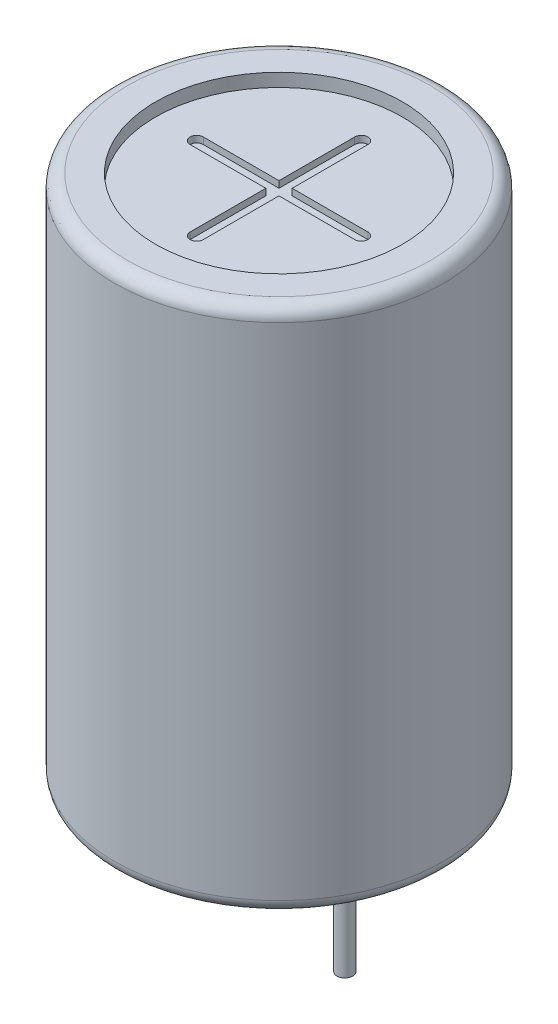
ISO-10303-21;
HEADER;
FILE_DESCRIPTION(('STEP AP214'),'2;1');
FILE_NAME('part.step','',(''),(''),'','','');
FILE_SCHEMA(('AUTOMOTIVE_DESIGN { 1 0 10303 214 1 1 1 1 }'));
ENDSEC;
DATA;
#1=APPLICATION_CONTEXT('core data for automotive mechanical design processes');
#2=APPLICATION_PROTOCOL_DEFINITION('international standard','automotive_design',2000,#1);
#3=PRODUCT_CONTEXT('',#1,'mechanical');
#4=PRODUCT('Part','Part','',(#3));
#5=PRODUCT_RELATED_PRODUCT_CATEGORY('part','',(#4));
#6=PRODUCT_DEFINITION_FORMATION('','',#4);
#7=PRODUCT_DEFINITION_CONTEXT('part definition',#1,'design');
#8=PRODUCT_DEFINITION('design','',#6,#7);
#9=PRODUCT_DEFINITION_SHAPE('','',#8);
#10=(LENGTH_UNIT() NAMED_UNIT(*) SI_UNIT(.MILLI.,.METRE.));
#11=(NAMED_UNIT(*) PLANE_ANGLE_UNIT() SI_UNIT($,.RADIAN.));
#12=(NAMED_UNIT(*) SI_UNIT($,.STERADIAN.) SOLID_ANGLE_UNIT());
#13=UNCERTAINTY_MEASURE_WITH_UNIT(LENGTH_MEASURE(1.E-05),#10,'distance_accuracy_value','');
#14=(GEOMETRIC_REPRESENTATION_CONTEXT(3) GLOBAL_UNCERTAINTY_ASSIGNED_CONTEXT((#13)) GLOBAL_UNIT_ASSIGNED_CONTEXT((#10,
#11,#12)) REPRESENTATION_CONTEXT('',''));
#15=CARTESIAN_POINT('',(0.,0.,0.));
#16=DIRECTION('',(0.,0.,1.));
#17=DIRECTION('',(1.,0.,0.));
#18=AXIS2_PLACEMENT_3D('',#15,#16,#17);
#19=CARTESIAN_POINT('',(-3.125,19.25,-0.250000000000001));
#20=DIRECTION('',(0.,0.,-1.));
#21=DIRECTION('',(-1.,0.,0.));
#22=AXIS2_PLACEMENT_3D('',#19,#20,#21);
#23=PLANE('',#22);
#24=DIRECTION('',(-1.,0.,0.));
#25=VECTOR('',#24,1.);
#26=CARTESIAN_POINT('',(-3.125,19.25,-0.250000000000001));
#27=LINE('',#26,#25);
#28=CARTESIAN_POINT('',(-0.250000000000001,19.25,-0.250000000000002));
#29=VERTEX_POINT('',#28);
#30=CARTESIAN_POINT('',(-3.125,19.25,-0.250000000000001));
#31=VERTEX_POINT('',#30);
#32=EDGE_CURVE('E218',#29,#31,#27,.T.);
#33=ORIENTED_EDGE('',*,*,#32,.F.);
#34=DIRECTION('',(0.,1.,0.));
#35=VECTOR('',#34,1.);
#36=CARTESIAN_POINT('',(-0.250000000000001,19.25,-0.250000000000002));
#37=LINE('',#36,#35);
#38=CARTESIAN_POINT('',(-0.250000000000002,19.5,-0.250000000000001));
#39=VERTEX_POINT('',#38);
#40=EDGE_CURVE('E201',#29,#39,#37,.T.);
#41=ORIENTED_EDGE('',*,*,#40,.T.);
#42=DIRECTION('',(-1.,0.,0.));
#43=VECTOR('',#42,1.);
#44=CARTESIAN_POINT('',(-3.125,19.5,-0.250000000000001));
#45=LINE('',#44,#43);
#46=CARTESIAN_POINT('',(-3.125,19.5,-0.250000000000001));
#47=VERTEX_POINT('',#46);
#48=EDGE_CURVE('E234',#39,#47,#45,.T.);
#49=ORIENTED_EDGE('',*,*,#48,.T.);
#50=DIRECTION('',(0.,1.,0.));
#51=VECTOR('',#50,1.);
#52=CARTESIAN_POINT('',(-3.125,19.25,-0.250000000000001));
#53=LINE('',#52,#51);
#54=EDGE_CURVE('E238',#31,#47,#53,.T.);
#55=ORIENTED_EDGE('',*,*,#54,.F.);
#56=EDGE_LOOP('',(#33,#41,#49,#55));
#57=FACE_BOUND('',#56,.T.);
#58=ADVANCED_FACE('F43',(#57),#23,.F.);
#59=CARTESIAN_POINT('',(-3.125,19.25,0.250000000000001));
#60=DIRECTION('',(0.,0.,1.));
#61=DIRECTION('',(1.,0.,0.));
#62=AXIS2_PLACEMENT_3D('',#59,#60,#61);
#63=PLANE('',#62);
#64=DIRECTION('',(1.,0.,0.));
#65=VECTOR('',#64,1.);
#66=CARTESIAN_POINT('',(-3.125,19.5,0.250000000000001));
#67=LINE('',#66,#65);
#68=CARTESIAN_POINT('',(-3.125,19.5,0.250000000000001));
#69=VERTEX_POINT('',#68);
#70=CARTESIAN_POINT('',(-0.250000000000002,19.5,0.250000000000001));
#71=VERTEX_POINT('',#70);
#72=EDGE_CURVE('E226',#69,#71,#67,.T.);
#73=ORIENTED_EDGE('',*,*,#72,.T.);
#74=DIRECTION('',(0.,-1.,0.));
#75=VECTOR('',#74,1.);
#76=CARTESIAN_POINT('',(-0.250000000000001,19.25,0.250000000000001));
#77=LINE('',#76,#75);
#78=CARTESIAN_POINT('',(-0.250000000000002,19.25,0.250000000000001));
#79=VERTEX_POINT('',#78);
#80=EDGE_CURVE('E197',#71,#79,#77,.T.);
#81=ORIENTED_EDGE('',*,*,#80,.T.);
#82=DIRECTION('',(1.,0.,0.));
#83=VECTOR('',#82,1.);
#84=CARTESIAN_POINT('',(-3.125,19.25,0.250000000000001));
#85=LINE('',#84,#83);
#86=CARTESIAN_POINT('',(-3.125,19.25,0.250000000000001));
#87=VERTEX_POINT('',#86);
#88=EDGE_CURVE('E212',#87,#79,#85,.T.);
#89=ORIENTED_EDGE('',*,*,#88,.F.);
#90=DIRECTION('',(0.,1.,0.));
#91=VECTOR('',#90,1.);
#92=CARTESIAN_POINT('',(-3.125,19.25,0.250000000000001));
#93=LINE('',#92,#91);
#94=EDGE_CURVE('E222',#87,#69,#93,.T.);
#95=ORIENTED_EDGE('',*,*,#94,.T.);
#96=EDGE_LOOP('',(#73,#81,#89,#95));
#97=FACE_BOUND('',#96,.T.);
#98=ADVANCED_FACE('F306',(#97),#63,.F.);
#99=CARTESIAN_POINT('',(0.,20.,0.));
#100=DIRECTION('',(0.,-1.,0.));
#101=DIRECTION('',(0.,0.,-1.));
#102=AXIS2_PLACEMENT_3D('',#99,#100,#101);
#103=CYLINDRICAL_SURFACE('',#102,6.25);
#104=CARTESIAN_POINT('',(0.,0.5,0.));
#105=DIRECTION('',(0.,1.,0.));
#106=DIRECTION('',(0.,0.,1.));
#107=AXIS2_PLACEMENT_3D('',#104,#105,#106);
#108=CIRCLE('',#107,6.25);
#109=CARTESIAN_POINT('',(0.,0.5,6.25));
#110=VERTEX_POINT('',#109);
#111=EDGE_CURVE('E272',#110,#110,#108,.T.);
#112=ORIENTED_EDGE('',*,*,#111,.T.);
#113=EDGE_LOOP('',(#112));
#114=FACE_BOUND('',#113,.T.);
#115=CARTESIAN_POINT('',(0.,19.5,0.));
#116=DIRECTION('',(0.,1.,0.));
#117=DIRECTION('',(0.,0.,1.));
#118=AXIS2_PLACEMENT_3D('',#115,#116,#117);
#119=CIRCLE('',#118,6.25);
#120=CARTESIAN_POINT('',(0.,19.5,6.25));
#121=VERTEX_POINT('',#120);
#122=EDGE_CURVE('E268',#121,#121,#119,.F.);
#123=ORIENTED_EDGE('',*,*,#122,.T.);
#124=EDGE_LOOP('',(#123));
#125=FACE_BOUND('',#124,.T.);
#126=ADVANCED_FACE('F303',(#114,#125),#103,.T.);
#127=CARTESIAN_POINT('',(0.,20.,0.));
#128=DIRECTION('',(0.,1.,0.));
#129=DIRECTION('',(0.,0.,1.));
#130=AXIS2_PLACEMENT_3D('',#127,#128,#129);
#131=PLANE('',#130);
#132=CARTESIAN_POINT('',(0.,20.,0.));
#133=DIRECTION('',(0.,1.,0.));
#134=DIRECTION('',(0.,0.,1.));
#135=AXIS2_PLACEMENT_3D('',#132,#133,#134);
#136=CIRCLE('',#135,4.6875);
#137=CARTESIAN_POINT('',(0.,20.,4.6875));
#138=VERTEX_POINT('',#137);
#139=EDGE_CURVE('E256',#138,#138,#136,.T.);
#140=ORIENTED_EDGE('',*,*,#139,.F.);
#141=EDGE_LOOP('',(#140));
#142=FACE_BOUND('',#141,.T.);
#143=CARTESIAN_POINT('',(0.,20.,0.));
#144=DIRECTION('',(0.,1.,0.));
#145=DIRECTION('',(0.,0.,1.));
#146=AXIS2_PLACEMENT_3D('',#143,#144,#145);
#147=CIRCLE('',#146,5.75);
#148=CARTESIAN_POINT('',(0.,20.,5.75));
#149=VERTEX_POINT('',#148);
#150=EDGE_CURVE('E280',#149,#149,#147,.T.);
#151=ORIENTED_EDGE('',*,*,#150,.T.);
#152=EDGE_LOOP('',(#151));
#153=FACE_BOUND('',#152,.T.);
#154=ADVANCED_FACE('F294',(#142,#153),#131,.T.);
#155=CARTESIAN_POINT('',(0.,0.,0.));
#156=DIRECTION('',(0.,1.,0.));
#157=DIRECTION('',(0.,0.,1.));
#158=AXIS2_PLACEMENT_3D('',#155,#156,#157);
#159=PLANE('',#158);
#160=CARTESIAN_POINT('',(2.5,0.,0.));
#161=DIRECTION('',(0.,1.,0.));
#162=DIRECTION('',(0.,0.,1.));
#163=AXIS2_PLACEMENT_3D('',#160,#161,#162);
#164=CIRCLE('',#163,0.3);
#165=CARTESIAN_POINT('',(2.5,0.,0.300000000000001));
#166=VERTEX_POINT('',#165);
#167=EDGE_CURVE('E11',#166,#166,#164,.F.);
#168=ORIENTED_EDGE('',*,*,#167,.F.);
#169=EDGE_LOOP('',(#168));
#170=FACE_BOUND('',#169,.T.);
#171=CARTESIAN_POINT('',(-2.5,0.,0.));
#172=DIRECTION('',(0.,1.,0.));
#173=DIRECTION('',(0.,0.,1.));
#174=AXIS2_PLACEMENT_3D('',#171,#172,#173);
#175=CIRCLE('',#174,0.3);
#176=CARTESIAN_POINT('',(-2.5,0.,0.3));
#177=VERTEX_POINT('',#176);
#178=EDGE_CURVE('E52',#177,#177,#175,.F.);
#179=ORIENTED_EDGE('',*,*,#178,.F.);
#180=EDGE_LOOP('',(#179));
#181=FACE_BOUND('',#180,.T.);
#182=CARTESIAN_POINT('',(0.,0.,0.));
#183=DIRECTION('',(0.,1.,0.));
#184=DIRECTION('',(0.,0.,1.));
#185=AXIS2_PLACEMENT_3D('',#182,#183,#184);
#186=CIRCLE('',#185,5.75);
#187=CARTESIAN_POINT('',(0.,0.,5.75));
#188=VERTEX_POINT('',#187);
#189=EDGE_CURVE('E276',#188,#188,#186,.F.);
#190=ORIENTED_EDGE('',*,*,#189,.T.);
#191=EDGE_LOOP('',(#190));
#192=FACE_BOUND('',#191,.T.);
#193=ADVANCED_FACE('F290',(#170,#181,#192),#159,.F.);
#194=CARTESIAN_POINT('',(0.,0.5,0.));
#195=DIRECTION('',(0.,1.,0.));
#196=DIRECTION('',(0.,0.,1.));
#197=AXIS2_PLACEMENT_3D('',#194,#195,#196);
#198=TOROIDAL_SURFACE('',#197,5.75,0.5);
#199=ORIENTED_EDGE('',*,*,#189,.F.);
#200=EDGE_LOOP('',(#199));
#201=FACE_BOUND('',#200,.T.);
#202=ORIENTED_EDGE('',*,*,#111,.F.);
#203=EDGE_LOOP('',(#202));
#204=FACE_BOUND('',#203,.T.);
#205=ADVANCED_FACE('F293',(#201,#204),#198,.T.);
#206=CARTESIAN_POINT('',(0.,19.5,0.));
#207=DIRECTION('',(0.,1.,0.));
#208=DIRECTION('',(0.,0.,1.));
#209=AXIS2_PLACEMENT_3D('',#206,#207,#208);
#210=TOROIDAL_SURFACE('',#209,5.75,0.5);
#211=ORIENTED_EDGE('',*,*,#122,.F.);
#212=EDGE_LOOP('',(#211));
#213=FACE_BOUND('',#212,.T.);
#214=ORIENTED_EDGE('',*,*,#150,.F.);
#215=EDGE_LOOP('',(#214));
#216=FACE_BOUND('',#215,.T.);
#217=ADVANCED_FACE('F45',(#213,#216),#210,.T.);
#218=CARTESIAN_POINT('',(-2.5,-5.,0.));
#219=DIRECTION('',(0.,1.,0.));
#220=DIRECTION('',(0.,0.,1.));
#221=AXIS2_PLACEMENT_3D('',#218,#219,#220);
#222=CYLINDRICAL_SURFACE('',#221,0.3);
#223=CARTESIAN_POINT('',(-2.5,-5.,0.));
#224=DIRECTION('',(0.,-1.,0.));
#225=DIRECTION('',(0.,0.,-1.));
#226=AXIS2_PLACEMENT_3D('',#223,#224,#225);
#227=CIRCLE('',#226,0.3);
#228=CARTESIAN_POINT('',(-2.5,-5.,-0.3));
#229=VERTEX_POINT('',#228);
#230=EDGE_CURVE('E264',#229,#229,#227,.T.);
#231=ORIENTED_EDGE('',*,*,#230,.F.);
#232=EDGE_LOOP('',(#231));
#233=FACE_BOUND('',#232,.T.);
#234=ORIENTED_EDGE('',*,*,#178,.T.);
#235=EDGE_LOOP('',(#234));
#236=FACE_BOUND('',#235,.T.);
#237=ADVANCED_FACE('F288',(#233,#236),#222,.T.);
#238=CARTESIAN_POINT('',(-2.5,-5.,0.));
#239=DIRECTION('',(0.,-1.,0.));
#240=DIRECTION('',(0.,0.,-1.));
#241=AXIS2_PLACEMENT_3D('',#238,#239,#240);
#242=PLANE('',#241);
#243=ORIENTED_EDGE('',*,*,#230,.T.);
#244=EDGE_LOOP('',(#243));
#245=FACE_BOUND('',#244,.T.);
#246=ADVANCED_FACE('F522',(#245),#242,.T.);
#247=CARTESIAN_POINT('',(2.5,-5.,0.));
#248=DIRECTION('',(0.,1.,0.));
#249=DIRECTION('',(0.,0.,1.));
#250=AXIS2_PLACEMENT_3D('',#247,#248,#249);
#251=CYLINDRICAL_SURFACE('',#250,0.3);
#252=CARTESIAN_POINT('',(2.5,-5.,0.));
#253=DIRECTION('',(0.,-1.,0.));
#254=DIRECTION('',(0.,0.,-1.));
#255=AXIS2_PLACEMENT_3D('',#252,#253,#254);
#256=CIRCLE('',#255,0.3);
#257=CARTESIAN_POINT('',(2.5,-5.,-0.299999999999999));
#258=VERTEX_POINT('',#257);
#259=EDGE_CURVE('E260',#258,#258,#256,.T.);
#260=ORIENTED_EDGE('',*,*,#259,.F.);
#261=EDGE_LOOP('',(#260));
#262=FACE_BOUND('',#261,.T.);
#263=ORIENTED_EDGE('',*,*,#167,.T.);
#264=EDGE_LOOP('',(#263));
#265=FACE_BOUND('',#264,.T.);
#266=ADVANCED_FACE('F513',(#262,#265),#251,.T.);
#267=CARTESIAN_POINT('',(2.5,-5.,0.));
#268=DIRECTION('',(0.,-1.,0.));
#269=DIRECTION('',(0.,0.,-1.));
#270=AXIS2_PLACEMENT_3D('',#267,#268,#269);
#271=PLANE('',#270);
#272=ORIENTED_EDGE('',*,*,#259,.T.);
#273=EDGE_LOOP('',(#272));
#274=FACE_BOUND('',#273,.T.);
#275=ADVANCED_FACE('F503',(#274),#271,.T.);
#276=CARTESIAN_POINT('',(0.,19.,0.));
#277=DIRECTION('',(0.,1.,0.));
#278=DIRECTION('',(0.,0.,1.));
#279=AXIS2_PLACEMENT_3D('',#276,#277,#278);
#280=CYLINDRICAL_SURFACE('',#279,4.6875);
#281=CARTESIAN_POINT('',(0.,19.5,0.));
#282=DIRECTION('',(0.,1.,0.));
#283=DIRECTION('',(0.,0.,1.));
#284=AXIS2_PLACEMENT_3D('',#281,#282,#283);
#285=CIRCLE('',#284,4.6875);
#286=CARTESIAN_POINT('',(0.,19.5,4.6875));
#287=VERTEX_POINT('',#286);
#288=EDGE_CURVE('E242',#287,#287,#285,.T.);
#289=ORIENTED_EDGE('',*,*,#288,.F.);
#290=EDGE_LOOP('',(#289));
#291=FACE_BOUND('',#290,.T.);
#292=ORIENTED_EDGE('',*,*,#139,.T.);
#293=EDGE_LOOP('',(#292));
#294=FACE_BOUND('',#293,.T.);
#295=ADVANCED_FACE('F495',(#291,#294),#280,.F.);
#296=CARTESIAN_POINT('',(0.,19.5,0.));
#297=DIRECTION('',(0.,1.,0.));
#298=DIRECTION('',(0.,0.,1.));
#299=AXIS2_PLACEMENT_3D('',#296,#297,#298);
#300=PLANE('',#299);
#301=DIRECTION('',(0.,0.,1.));
#302=VECTOR('',#301,1.);
#303=CARTESIAN_POINT('',(-0.250000000000001,19.5,3.125));
#304=LINE('',#303,#302);
#305=CARTESIAN_POINT('',(-0.250000000000001,19.5,3.125));
#306=VERTEX_POINT('',#305);
#307=EDGE_CURVE('E165',#71,#306,#304,.T.);
#308=ORIENTED_EDGE('',*,*,#307,.F.);
#309=ORIENTED_EDGE('',*,*,#72,.F.);
#310=CARTESIAN_POINT('',(-3.125,19.5,0.));
#311=DIRECTION('',(0.,1.,0.));
#312=DIRECTION('',(0.,0.,1.));
#313=AXIS2_PLACEMENT_3D('',#310,#311,#312);
#314=CIRCLE('',#313,0.250000000000001);
#315=EDGE_CURVE('E205',#47,#69,#314,.T.);
#316=ORIENTED_EDGE('',*,*,#315,.F.);
#317=ORIENTED_EDGE('',*,*,#48,.F.);
#318=CARTESIAN_POINT('',(-0.250000000000002,19.5,-3.125));
#319=VERTEX_POINT('',#318);
#320=EDGE_CURVE('E159',#319,#39,#304,.T.);
#321=ORIENTED_EDGE('',*,*,#320,.F.);
#322=CARTESIAN_POINT('',(0.,19.5,-3.125));
#323=DIRECTION('',(0.,1.,0.));
#324=DIRECTION('',(0.,0.,1.));
#325=AXIS2_PLACEMENT_3D('',#322,#323,#324);
#326=CIRCLE('',#325,0.250000000000001);
#327=CARTESIAN_POINT('',(0.25,19.5,-3.125));
#328=VERTEX_POINT('',#327);
#329=EDGE_CURVE('E178',#328,#319,#326,.T.);
#330=ORIENTED_EDGE('',*,*,#329,.F.);
#331=DIRECTION('',(0.,0.,-1.));
#332=VECTOR('',#331,1.);
#333=CARTESIAN_POINT('',(0.250000000000001,19.5,3.125));
#334=LINE('',#333,#332);
#335=CARTESIAN_POINT('',(0.250000000000001,19.5,-0.250000000000001));
#336=VERTEX_POINT('',#335);
#337=EDGE_CURVE('E174',#336,#328,#334,.T.);
#338=ORIENTED_EDGE('',*,*,#337,.F.);
#339=CARTESIAN_POINT('',(3.125,19.5,-0.250000000000002));
#340=VERTEX_POINT('',#339);
#341=EDGE_CURVE('E211',#340,#336,#45,.T.);
#342=ORIENTED_EDGE('',*,*,#341,.F.);
#343=CARTESIAN_POINT('',(3.125,19.5,0.));
#344=DIRECTION('',(0.,1.,0.));
#345=DIRECTION('',(0.,0.,1.));
#346=AXIS2_PLACEMENT_3D('',#343,#344,#345);
#347=CIRCLE('',#346,0.250000000000001);
#348=CARTESIAN_POINT('',(3.125,19.5,0.25));
#349=VERTEX_POINT('',#348);
#350=EDGE_CURVE('E230',#349,#340,#347,.T.);
#351=ORIENTED_EDGE('',*,*,#350,.F.);
#352=CARTESIAN_POINT('',(0.250000000000001,19.5,0.250000000000001));
#353=VERTEX_POINT('',#352);
#354=EDGE_CURVE('E225',#353,#349,#67,.T.);
#355=ORIENTED_EDGE('',*,*,#354,.F.);
#356=CARTESIAN_POINT('',(0.250000000000001,19.5,3.125));
#357=VERTEX_POINT('',#356);
#358=EDGE_CURVE('E175',#357,#353,#334,.T.);
#359=ORIENTED_EDGE('',*,*,#358,.F.);
#360=CARTESIAN_POINT('',(0.,19.5,3.125));
#361=DIRECTION('',(0.,1.,0.));
#362=DIRECTION('',(0.,0.,1.));
#363=AXIS2_PLACEMENT_3D('',#360,#361,#362);
#364=CIRCLE('',#363,0.250000000000001);
#365=EDGE_CURVE('E139',#306,#357,#364,.T.);
#366=ORIENTED_EDGE('',*,*,#365,.F.);
#367=EDGE_LOOP('',(#308,#309,#316,#317,#321,#330,#338,#342,#351,#355,#359,#366));
#368=FACE_BOUND('',#367,.T.);
#369=ORIENTED_EDGE('',*,*,#288,.T.);
#370=EDGE_LOOP('',(#369));
#371=FACE_BOUND('',#370,.T.);
#372=ADVANCED_FACE('F343',(#368,#371),#300,.T.);
#373=CARTESIAN_POINT('',(-3.125,19.25,0.));
#374=DIRECTION('',(0.,1.,0.));
#375=DIRECTION('',(0.,0.,1.));
#376=AXIS2_PLACEMENT_3D('',#373,#374,#375);
#377=CYLINDRICAL_SURFACE('',#376,0.250000000000001);
#378=ORIENTED_EDGE('',*,*,#315,.T.);
#379=ORIENTED_EDGE('',*,*,#94,.F.);
#380=CARTESIAN_POINT('',(-3.125,19.25,0.));
#381=DIRECTION('',(0.,1.,0.));
#382=DIRECTION('',(0.,0.,1.));
#383=AXIS2_PLACEMENT_3D('',#380,#381,#382);
#384=CIRCLE('',#383,0.250000000000001);
#385=EDGE_CURVE('E206',#31,#87,#384,.T.);
#386=ORIENTED_EDGE('',*,*,#385,.F.);
#387=ORIENTED_EDGE('',*,*,#54,.T.);
#388=EDGE_LOOP('',(#378,#379,#386,#387));
#389=FACE_BOUND('',#388,.T.);
#390=ADVANCED_FACE('F336',(#389),#377,.F.);
#391=ORIENTED_EDGE('',*,*,#341,.T.);
#392=DIRECTION('',(0.,-1.,0.));
#393=VECTOR('',#392,1.);
#394=CARTESIAN_POINT('',(0.250000000000001,19.25,-0.250000000000002));
#395=LINE('',#394,#393);
#396=CARTESIAN_POINT('',(0.250000000000001,19.25,-0.250000000000002));
#397=VERTEX_POINT('',#396);
#398=EDGE_CURVE('E193',#336,#397,#395,.T.);
#399=ORIENTED_EDGE('',*,*,#398,.T.);
#400=CARTESIAN_POINT('',(3.125,19.25,-0.250000000000002));
#401=VERTEX_POINT('',#400);
#402=EDGE_CURVE('E219',#401,#397,#27,.T.);
#403=ORIENTED_EDGE('',*,*,#402,.F.);
#404=DIRECTION('',(0.,1.,0.));
#405=VECTOR('',#404,1.);
#406=CARTESIAN_POINT('',(3.125,19.25,-0.250000000000002));
#407=LINE('',#406,#405);
#408=EDGE_CURVE('E243',#401,#340,#407,.T.);
#409=ORIENTED_EDGE('',*,*,#408,.T.);
#410=EDGE_LOOP('',(#391,#399,#403,#409));
#411=FACE_BOUND('',#410,.T.);
#412=ADVANCED_FACE('F324',(#411),#23,.F.);
#413=CARTESIAN_POINT('',(3.125,19.25,0.));
#414=DIRECTION('',(0.,1.,0.));
#415=DIRECTION('',(0.,0.,1.));
#416=AXIS2_PLACEMENT_3D('',#413,#414,#415);
#417=CYLINDRICAL_SURFACE('',#416,0.250000000000001);
#418=ORIENTED_EDGE('',*,*,#350,.T.);
#419=ORIENTED_EDGE('',*,*,#408,.F.);
#420=CARTESIAN_POINT('',(3.125,19.25,0.));
#421=DIRECTION('',(0.,1.,0.));
#422=DIRECTION('',(0.,0.,1.));
#423=AXIS2_PLACEMENT_3D('',#420,#421,#422);
#424=CIRCLE('',#423,0.250000000000001);
#425=CARTESIAN_POINT('',(3.125,19.25,0.25));
#426=VERTEX_POINT('',#425);
#427=EDGE_CURVE('E214',#426,#401,#424,.T.);
#428=ORIENTED_EDGE('',*,*,#427,.F.);
#429=DIRECTION('',(0.,1.,0.));
#430=VECTOR('',#429,1.);
#431=CARTESIAN_POINT('',(3.125,19.25,0.25));
#432=LINE('',#431,#430);
#433=EDGE_CURVE('E246',#426,#349,#432,.T.);
#434=ORIENTED_EDGE('',*,*,#433,.T.);
#435=EDGE_LOOP('',(#418,#419,#428,#434));
#436=FACE_BOUND('',#435,.T.);
#437=ADVANCED_FACE('F335',(#436),#417,.F.);
#438=CARTESIAN_POINT('',(0.250000000000001,19.25,0.25));
#439=VERTEX_POINT('',#438);
#440=EDGE_CURVE('E210',#439,#426,#85,.T.);
#441=ORIENTED_EDGE('',*,*,#440,.F.);
#442=DIRECTION('',(0.,1.,0.));
#443=VECTOR('',#442,1.);
#444=CARTESIAN_POINT('',(0.250000000000001,19.25,0.25));
#445=LINE('',#444,#443);
#446=EDGE_CURVE('E147',#439,#353,#445,.T.);
#447=ORIENTED_EDGE('',*,*,#446,.T.);
#448=ORIENTED_EDGE('',*,*,#354,.T.);
#449=ORIENTED_EDGE('',*,*,#433,.F.);
#450=EDGE_LOOP('',(#441,#447,#448,#449));
#451=FACE_BOUND('',#450,.T.);
#452=ADVANCED_FACE('F330',(#451),#63,.F.);
#453=CARTESIAN_POINT('',(-3.125,19.25,0.));
#454=DIRECTION('',(0.,1.,0.));
#455=DIRECTION('',(0.,0.,1.));
#456=AXIS2_PLACEMENT_3D('',#453,#454,#455);
#457=PLANE('',#456);
#458=ORIENTED_EDGE('',*,*,#402,.T.);
#459=DIRECTION('',(0.,0.,-1.));
#460=VECTOR('',#459,1.);
#461=CARTESIAN_POINT('',(0.250000000000001,19.25,3.125));
#462=LINE('',#461,#460);
#463=CARTESIAN_POINT('',(0.25,19.25,-3.125));
#464=VERTEX_POINT('',#463);
#465=EDGE_CURVE('E151',#397,#464,#462,.T.);
#466=ORIENTED_EDGE('',*,*,#465,.T.);
#467=CARTESIAN_POINT('',(0.,19.25,-3.125));
#468=DIRECTION('',(0.,1.,0.));
#469=DIRECTION('',(0.,0.,1.));
#470=AXIS2_PLACEMENT_3D('',#467,#468,#469);
#471=CIRCLE('',#470,0.250000000000001);
#472=CARTESIAN_POINT('',(-0.250000000000002,19.25,-3.125));
#473=VERTEX_POINT('',#472);
#474=EDGE_CURVE('E150',#464,#473,#471,.T.);
#475=ORIENTED_EDGE('',*,*,#474,.T.);
#476=DIRECTION('',(0.,0.,1.));
#477=VECTOR('',#476,1.);
#478=CARTESIAN_POINT('',(-0.250000000000001,19.25,3.125));
#479=LINE('',#478,#477);
#480=EDGE_CURVE('E59',#473,#29,#479,.T.);
#481=ORIENTED_EDGE('',*,*,#480,.T.);
#482=ORIENTED_EDGE('',*,*,#32,.T.);
#483=ORIENTED_EDGE('',*,*,#385,.T.);
#484=ORIENTED_EDGE('',*,*,#88,.T.);
#485=CARTESIAN_POINT('',(-0.250000000000001,19.25,3.125));
#486=VERTEX_POINT('',#485);
#487=EDGE_CURVE('E156',#79,#486,#479,.T.);
#488=ORIENTED_EDGE('',*,*,#487,.T.);
#489=CARTESIAN_POINT('',(0.,19.25,3.125));
#490=DIRECTION('',(0.,1.,0.));
#491=DIRECTION('',(0.,0.,1.));
#492=AXIS2_PLACEMENT_3D('',#489,#490,#491);
#493=CIRCLE('',#492,0.250000000000001);
#494=CARTESIAN_POINT('',(0.250000000000001,19.25,3.125));
#495=VERTEX_POINT('',#494);
#496=EDGE_CURVE('E137',#486,#495,#493,.T.);
#497=ORIENTED_EDGE('',*,*,#496,.T.);
#498=EDGE_CURVE('E66',#495,#439,#462,.T.);
#499=ORIENTED_EDGE('',*,*,#498,.T.);
#500=ORIENTED_EDGE('',*,*,#440,.T.);
#501=ORIENTED_EDGE('',*,*,#427,.T.);
#502=EDGE_LOOP('',(#458,#466,#475,#481,#482,#483,#484,#488,#497,#499,#500,#501));
#503=FACE_BOUND('',#502,.T.);
#504=ADVANCED_FACE('F154',(#503),#457,.T.);
#505=CARTESIAN_POINT('',(0.250000000000001,19.25,3.125));
#506=DIRECTION('',(1.,0.,0.));
#507=DIRECTION('',(0.,0.,-1.));
#508=AXIS2_PLACEMENT_3D('',#505,#506,#507);
#509=PLANE('',#508);
#510=ORIENTED_EDGE('',*,*,#498,.F.);
#511=DIRECTION('',(0.,1.,0.));
#512=VECTOR('',#511,1.);
#513=CARTESIAN_POINT('',(0.250000000000001,19.25,3.125));
#514=LINE('',#513,#512);
#515=EDGE_CURVE('E134',#495,#357,#514,.T.);
#516=ORIENTED_EDGE('',*,*,#515,.T.);
#517=ORIENTED_EDGE('',*,*,#358,.T.);
#518=ORIENTED_EDGE('',*,*,#446,.F.);
#519=EDGE_LOOP('',(#510,#516,#517,#518));
#520=FACE_BOUND('',#519,.T.);
#521=ADVANCED_FACE('F145',(#520),#509,.F.);
#522=CARTESIAN_POINT('',(-0.250000000000001,19.25,3.125));
#523=DIRECTION('',(-1.,0.,0.));
#524=DIRECTION('',(0.,0.,1.));
#525=AXIS2_PLACEMENT_3D('',#522,#523,#524);
#526=PLANE('',#525);
#527=ORIENTED_EDGE('',*,*,#307,.T.);
#528=DIRECTION('',(0.,1.,0.));
#529=VECTOR('',#528,1.);
#530=CARTESIAN_POINT('',(-0.250000000000001,19.25,3.125));
#531=LINE('',#530,#529);
#532=EDGE_CURVE('E182',#486,#306,#531,.T.);
#533=ORIENTED_EDGE('',*,*,#532,.F.);
#534=ORIENTED_EDGE('',*,*,#487,.F.);
#535=ORIENTED_EDGE('',*,*,#80,.F.);
#536=EDGE_LOOP('',(#527,#533,#534,#535));
#537=FACE_BOUND('',#536,.T.);
#538=ADVANCED_FACE('F410',(#537),#526,.F.);
#539=CARTESIAN_POINT('',(0.,19.25,3.125));
#540=DIRECTION('',(0.,1.,0.));
#541=DIRECTION('',(0.,0.,1.));
#542=AXIS2_PLACEMENT_3D('',#539,#540,#541);
#543=CYLINDRICAL_SURFACE('',#542,0.250000000000001);
#544=ORIENTED_EDGE('',*,*,#365,.T.);
#545=ORIENTED_EDGE('',*,*,#515,.F.);
#546=ORIENTED_EDGE('',*,*,#496,.F.);
#547=ORIENTED_EDGE('',*,*,#532,.T.);
#548=EDGE_LOOP('',(#544,#545,#546,#547));
#549=FACE_BOUND('',#548,.T.);
#550=ADVANCED_FACE('F135',(#549),#543,.F.);
#551=ORIENTED_EDGE('',*,*,#480,.F.);
#552=DIRECTION('',(0.,1.,0.));
#553=VECTOR('',#552,1.);
#554=CARTESIAN_POINT('',(-0.250000000000002,19.25,-3.125));
#555=LINE('',#554,#553);
#556=EDGE_CURVE('E185',#473,#319,#555,.T.);
#557=ORIENTED_EDGE('',*,*,#556,.T.);
#558=ORIENTED_EDGE('',*,*,#320,.T.);
#559=ORIENTED_EDGE('',*,*,#40,.F.);
#560=EDGE_LOOP('',(#551,#557,#558,#559));
#561=FACE_BOUND('',#560,.T.);
#562=ADVANCED_FACE('F420',(#561),#526,.F.);
#563=ORIENTED_EDGE('',*,*,#337,.T.);
#564=DIRECTION('',(0.,1.,0.));
#565=VECTOR('',#564,1.);
#566=CARTESIAN_POINT('',(0.25,19.25,-3.125));
#567=LINE('',#566,#565);
#568=EDGE_CURVE('E143',#464,#328,#567,.T.);
#569=ORIENTED_EDGE('',*,*,#568,.F.);
#570=ORIENTED_EDGE('',*,*,#465,.F.);
#571=ORIENTED_EDGE('',*,*,#398,.F.);
#572=EDGE_LOOP('',(#563,#569,#570,#571));
#573=FACE_BOUND('',#572,.T.);
#574=ADVANCED_FACE('F416',(#573),#509,.F.);
#575=CARTESIAN_POINT('',(0.,19.25,-3.125));
#576=DIRECTION('',(0.,1.,0.));
#577=DIRECTION('',(0.,0.,1.));
#578=AXIS2_PLACEMENT_3D('',#575,#576,#577);
#579=CYLINDRICAL_SURFACE('',#578,0.250000000000001);
#580=ORIENTED_EDGE('',*,*,#329,.T.);
#581=ORIENTED_EDGE('',*,*,#556,.F.);
#582=ORIENTED_EDGE('',*,*,#474,.F.);
#583=ORIENTED_EDGE('',*,*,#568,.T.);
#584=EDGE_LOOP('',(#580,#581,#582,#583));
#585=FACE_BOUND('',#584,.T.);
#586=ADVANCED_FACE('F418',(#585),#579,.F.);
#587=CLOSED_SHELL('',(#58,#98,#126,#154,#193,#205,#217,#237,#246,#266,#275,#295,#372,#390,#412,
#437,#452,#504,#521,#538,#550,#562,#574,#586));
#588=MANIFOLD_SOLID_BREP('B2',#587);
#589=ADVANCED_BREP_SHAPE_REPRESENTATION('',(#18,#588),#14);
#590=SHAPE_DEFINITION_REPRESENTATION(#9,#589);
ENDSEC;
END-ISO-10303-21;
